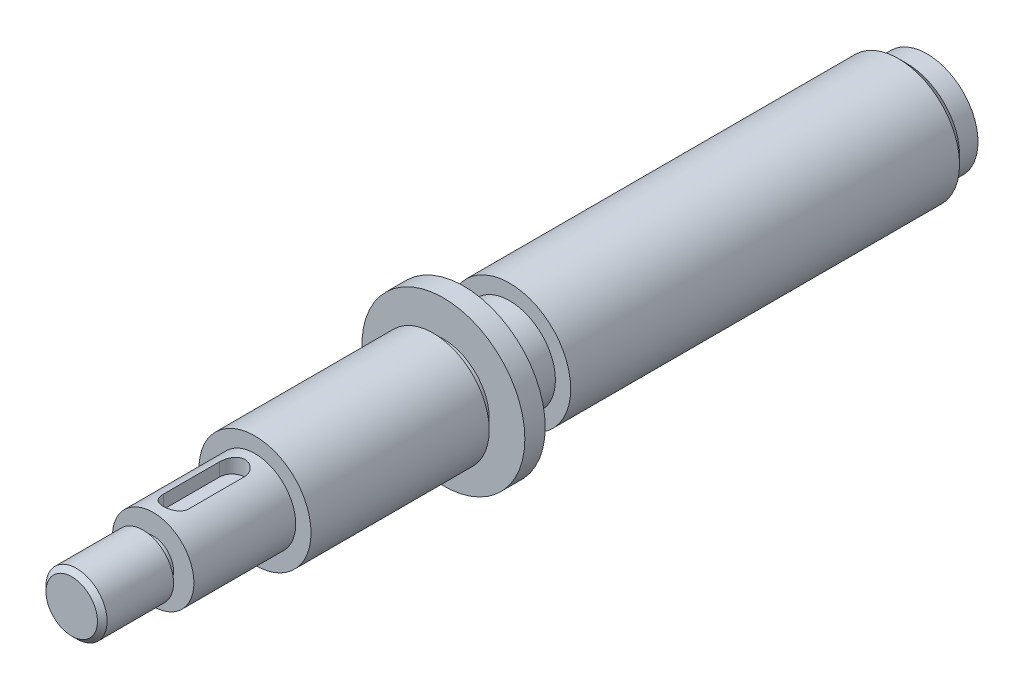
ISO-10303-21;
HEADER;
FILE_DESCRIPTION(('STEP AP214'),'2;1');
FILE_NAME('part.step','',(''),(''),'','','');
FILE_SCHEMA(('AUTOMOTIVE_DESIGN { 1 0 10303 214 1 1 1 1 }'));
ENDSEC;
DATA;
#1=APPLICATION_CONTEXT('core data for automotive mechanical design processes');
#2=APPLICATION_PROTOCOL_DEFINITION('international standard','automotive_design',2000,#1);
#3=PRODUCT_CONTEXT('',#1,'mechanical');
#4=PRODUCT('Part','Part','',(#3));
#5=PRODUCT_RELATED_PRODUCT_CATEGORY('part','',(#4));
#6=PRODUCT_DEFINITION_FORMATION('','',#4);
#7=PRODUCT_DEFINITION_CONTEXT('part definition',#1,'design');
#8=PRODUCT_DEFINITION('design','',#6,#7);
#9=PRODUCT_DEFINITION_SHAPE('','',#8);
#10=(LENGTH_UNIT() NAMED_UNIT(*) SI_UNIT(.MILLI.,.METRE.));
#11=(NAMED_UNIT(*) PLANE_ANGLE_UNIT() SI_UNIT($,.RADIAN.));
#12=(NAMED_UNIT(*) SI_UNIT($,.STERADIAN.) SOLID_ANGLE_UNIT());
#13=UNCERTAINTY_MEASURE_WITH_UNIT(LENGTH_MEASURE(1.E-05),#10,'distance_accuracy_value','');
#14=(GEOMETRIC_REPRESENTATION_CONTEXT(3) GLOBAL_UNCERTAINTY_ASSIGNED_CONTEXT((#13)) GLOBAL_UNIT_ASSIGNED_CONTEXT((#10,
#11,#12)) REPRESENTATION_CONTEXT('',''));
#15=CARTESIAN_POINT('',(0.,0.,0.));
#16=DIRECTION('',(0.,0.,1.));
#17=DIRECTION('',(1.,0.,0.));
#18=AXIS2_PLACEMENT_3D('',#15,#16,#17);
#19=CARTESIAN_POINT('',(0.,0.,97.));
#20=DIRECTION('',(0.,0.,-1.));
#21=DIRECTION('',(-1.,0.,0.));
#22=AXIS2_PLACEMENT_3D('',#19,#20,#21);
#23=CYLINDRICAL_SURFACE('',#22,9.);
#24=CARTESIAN_POINT('',(0.,0.,82.));
#25=DIRECTION('',(0.,0.,1.));
#26=DIRECTION('',(1.,0.,0.));
#27=AXIS2_PLACEMENT_3D('',#24,#25,#26);
#28=CIRCLE('',#27,9.);
#29=CARTESIAN_POINT('',(9.,0.,82.));
#30=VERTEX_POINT('',#29);
#31=EDGE_CURVE('E177',#30,#30,#28,.T.);
#32=ORIENTED_EDGE('',*,*,#31,.T.);
#33=EDGE_LOOP('',(#32));
#34=FACE_BOUND('',#33,.T.);
#35=CARTESIAN_POINT('',(0.,0.,91.));
#36=DIRECTION('',(0.,0.,1.));
#37=DIRECTION('',(1.,0.,0.));
#38=AXIS2_PLACEMENT_3D('',#35,#36,#37);
#39=CIRCLE('',#38,9.);
#40=CARTESIAN_POINT('',(9.,0.,91.));
#41=VERTEX_POINT('',#40);
#42=EDGE_CURVE('E155',#41,#41,#39,.T.);
#43=ORIENTED_EDGE('',*,*,#42,.F.);
#44=EDGE_LOOP('',(#43));
#45=FACE_BOUND('',#44,.T.);
#46=ADVANCED_FACE('F47',(#34,#45),#23,.T.);
#47=CARTESIAN_POINT('',(0.,0.,4.));
#48=DIRECTION('',(0.,0.,1.));
#49=DIRECTION('',(1.,0.,0.));
#50=AXIS2_PLACEMENT_3D('',#47,#48,#49);
#51=PLANE('',#50);
#52=CARTESIAN_POINT('',(0.,0.,4.));
#53=DIRECTION('',(0.,0.,1.));
#54=DIRECTION('',(1.,0.,0.));
#55=AXIS2_PLACEMENT_3D('',#52,#53,#54);
#56=CIRCLE('',#55,10.);
#57=CARTESIAN_POINT('',(10.,0.,4.));
#58=VERTEX_POINT('',#57);
#59=EDGE_CURVE('E181',#58,#58,#56,.T.);
#60=ORIENTED_EDGE('',*,*,#59,.T.);
#61=EDGE_LOOP('',(#60));
#62=FACE_BOUND('',#61,.T.);
#63=CARTESIAN_POINT('',(0.,0.,4.));
#64=DIRECTION('',(0.,0.,1.));
#65=DIRECTION('',(1.,0.,0.));
#66=AXIS2_PLACEMENT_3D('',#63,#64,#65);
#67=CIRCLE('',#66,10.376);
#68=CARTESIAN_POINT('',(10.376,0.,4.));
#69=VERTEX_POINT('',#68);
#70=EDGE_CURVE('E176',#69,#69,#67,.T.);
#71=ORIENTED_EDGE('',*,*,#70,.F.);
#72=EDGE_LOOP('',(#71));
#73=FACE_BOUND('',#72,.T.);
#74=ADVANCED_FACE('F266',(#62,#73),#51,.F.);
#75=CARTESIAN_POINT('',(0.,0.,4.));
#76=DIRECTION('',(0.,0.,-1.));
#77=DIRECTION('',(-1.,0.,0.));
#78=AXIS2_PLACEMENT_3D('',#75,#76,#77);
#79=CYLINDRICAL_SURFACE('',#78,10.);
#80=ORIENTED_EDGE('',*,*,#59,.F.);
#81=EDGE_LOOP('',(#80));
#82=FACE_BOUND('',#81,.T.);
#83=CARTESIAN_POINT('',(0.,0.,0.));
#84=DIRECTION('',(0.,0.,1.));
#85=DIRECTION('',(1.,0.,0.));
#86=AXIS2_PLACEMENT_3D('',#83,#84,#85);
#87=CIRCLE('',#86,10.);
#88=CARTESIAN_POINT('',(10.,0.,0.));
#89=VERTEX_POINT('',#88);
#90=EDGE_CURVE('E193',#89,#89,#87,.T.);
#91=ORIENTED_EDGE('',*,*,#90,.T.);
#92=EDGE_LOOP('',(#91));
#93=FACE_BOUND('',#92,.T.);
#94=ADVANCED_FACE('F49',(#82,#93),#79,.T.);
#95=CARTESIAN_POINT('',(0.,0.,0.));
#96=DIRECTION('',(0.,0.,1.));
#97=DIRECTION('',(1.,0.,0.));
#98=AXIS2_PLACEMENT_3D('',#95,#96,#97);
#99=PLANE('',#98);
#100=ORIENTED_EDGE('',*,*,#90,.F.);
#101=EDGE_LOOP('',(#100));
#102=FACE_BOUND('',#101,.T.);
#103=ADVANCED_FACE('F329',(#102),#99,.F.);
#104=CARTESIAN_POINT('',(0.,0.,4.));
#105=DIRECTION('',(0.,0.,1.));
#106=DIRECTION('',(1.,0.,0.));
#107=AXIS2_PLACEMENT_3D('',#104,#105,#106);
#108=CONICAL_SURFACE('',#107,10.376,0.785398163397447);
#109=CARTESIAN_POINT('',(0.,0.,5.624));
#110=DIRECTION('',(0.,0.,1.));
#111=DIRECTION('',(1.,0.,0.));
#112=AXIS2_PLACEMENT_3D('',#109,#110,#111);
#113=CIRCLE('',#112,12.);
#114=CARTESIAN_POINT('',(12.,0.,5.624));
#115=VERTEX_POINT('',#114);
#116=EDGE_CURVE('E185',#115,#115,#113,.T.);
#117=ORIENTED_EDGE('',*,*,#116,.F.);
#118=EDGE_LOOP('',(#117));
#119=FACE_BOUND('',#118,.T.);
#120=ORIENTED_EDGE('',*,*,#70,.T.);
#121=EDGE_LOOP('',(#120));
#122=FACE_BOUND('',#121,.T.);
#123=ADVANCED_FACE('F325',(#119,#122),#108,.T.);
#124=CARTESIAN_POINT('',(0.,0.,82.));
#125=DIRECTION('',(0.,0.,1.));
#126=DIRECTION('',(1.,0.,0.));
#127=AXIS2_PLACEMENT_3D('',#124,#125,#126);
#128=PLANE('',#127);
#129=ORIENTED_EDGE('',*,*,#31,.F.);
#130=EDGE_LOOP('',(#129));
#131=FACE_BOUND('',#130,.T.);
#132=CARTESIAN_POINT('',(0.,0.,82.));
#133=DIRECTION('',(0.,0.,1.));
#134=DIRECTION('',(1.,0.,0.));
#135=AXIS2_PLACEMENT_3D('',#132,#133,#134);
#136=CIRCLE('',#135,12.);
#137=CARTESIAN_POINT('',(12.,0.,82.));
#138=VERTEX_POINT('',#137);
#139=EDGE_CURVE('E189',#138,#138,#136,.T.);
#140=ORIENTED_EDGE('',*,*,#139,.T.);
#141=EDGE_LOOP('',(#140));
#142=FACE_BOUND('',#141,.T.);
#143=ADVANCED_FACE('F315',(#131,#142),#128,.T.);
#144=CARTESIAN_POINT('',(0.,0.,82.));
#145=DIRECTION('',(0.,0.,-1.));
#146=DIRECTION('',(-1.,0.,0.));
#147=AXIS2_PLACEMENT_3D('',#144,#145,#146);
#148=CYLINDRICAL_SURFACE('',#147,12.);
#149=ORIENTED_EDGE('',*,*,#116,.T.);
#150=EDGE_LOOP('',(#149));
#151=FACE_BOUND('',#150,.T.);
#152=ORIENTED_EDGE('',*,*,#139,.F.);
#153=EDGE_LOOP('',(#152));
#154=FACE_BOUND('',#153,.T.);
#155=ADVANCED_FACE('F310',(#151,#154),#148,.T.);
#156=CARTESIAN_POINT('',(0.,0.,91.));
#157=DIRECTION('',(0.,0.,1.));
#158=DIRECTION('',(1.,0.,0.));
#159=AXIS2_PLACEMENT_3D('',#156,#157,#158);
#160=CYLINDRICAL_SURFACE('',#159,16.);
#161=CARTESIAN_POINT('',(0.,0.,91.));
#162=DIRECTION('',(0.,0.,1.));
#163=DIRECTION('',(1.,0.,0.));
#164=AXIS2_PLACEMENT_3D('',#161,#162,#163);
#165=CIRCLE('',#164,16.);
#166=CARTESIAN_POINT('',(16.,0.,91.));
#167=VERTEX_POINT('',#166);
#168=EDGE_CURVE('E164',#167,#167,#165,.T.);
#169=ORIENTED_EDGE('',*,*,#168,.T.);
#170=EDGE_LOOP('',(#169));
#171=FACE_BOUND('',#170,.T.);
#172=CARTESIAN_POINT('',(0.,0.,95.));
#173=DIRECTION('',(0.,0.,1.));
#174=DIRECTION('',(1.,0.,0.));
#175=AXIS2_PLACEMENT_3D('',#172,#173,#174);
#176=CIRCLE('',#175,16.);
#177=CARTESIAN_POINT('',(16.,0.,95.));
#178=VERTEX_POINT('',#177);
#179=EDGE_CURVE('E160',#178,#178,#176,.T.);
#180=ORIENTED_EDGE('',*,*,#179,.F.);
#181=EDGE_LOOP('',(#180));
#182=FACE_BOUND('',#181,.T.);
#183=ADVANCED_FACE('F308',(#171,#182),#160,.T.);
#184=CARTESIAN_POINT('',(0.,0.,91.));
#185=DIRECTION('',(0.,0.,1.));
#186=DIRECTION('',(1.,0.,0.));
#187=AXIS2_PLACEMENT_3D('',#184,#185,#186);
#188=PLANE('',#187);
#189=ORIENTED_EDGE('',*,*,#42,.T.);
#190=EDGE_LOOP('',(#189));
#191=FACE_BOUND('',#190,.T.);
#192=ORIENTED_EDGE('',*,*,#168,.F.);
#193=EDGE_LOOP('',(#192));
#194=FACE_BOUND('',#193,.T.);
#195=ADVANCED_FACE('F291',(#191,#194),#188,.F.);
#196=CARTESIAN_POINT('',(0.,0.,95.));
#197=DIRECTION('',(0.,0.,1.));
#198=DIRECTION('',(1.,0.,0.));
#199=AXIS2_PLACEMENT_3D('',#196,#197,#198);
#200=PLANE('',#199);
#201=CARTESIAN_POINT('',(0.,0.,95.));
#202=DIRECTION('',(0.,0.,1.));
#203=DIRECTION('',(1.,0.,0.));
#204=AXIS2_PLACEMENT_3D('',#201,#202,#203);
#205=CIRCLE('',#204,9.);
#206=CARTESIAN_POINT('',(9.,0.,95.));
#207=VERTEX_POINT('',#206);
#208=EDGE_CURVE('E168',#207,#207,#205,.T.);
#209=ORIENTED_EDGE('',*,*,#208,.F.);
#210=EDGE_LOOP('',(#209));
#211=FACE_BOUND('',#210,.T.);
#212=ORIENTED_EDGE('',*,*,#179,.T.);
#213=EDGE_LOOP('',(#212));
#214=FACE_BOUND('',#213,.T.);
#215=ADVANCED_FACE('F282',(#211,#214),#200,.T.);
#216=ORIENTED_EDGE('',*,*,#208,.T.);
#217=EDGE_LOOP('',(#216));
#218=FACE_BOUND('',#217,.T.);
#219=CARTESIAN_POINT('',(0.,0.,97.));
#220=DIRECTION('',(0.,0.,1.));
#221=DIRECTION('',(1.,0.,0.));
#222=AXIS2_PLACEMENT_3D('',#219,#220,#221);
#223=CIRCLE('',#222,9.);
#224=CARTESIAN_POINT('',(9.,0.,97.));
#225=VERTEX_POINT('',#224);
#226=EDGE_CURVE('E172',#225,#225,#223,.T.);
#227=ORIENTED_EDGE('',*,*,#226,.F.);
#228=EDGE_LOOP('',(#227));
#229=FACE_BOUND('',#228,.T.);
#230=ADVANCED_FACE('F269',(#218,#229),#23,.T.);
#231=CARTESIAN_POINT('',(0.,0.,132.));
#232=DIRECTION('',(0.,0.,-1.));
#233=DIRECTION('',(-1.,0.,0.));
#234=AXIS2_PLACEMENT_3D('',#231,#232,#233);
#235=CYLINDRICAL_SURFACE('',#234,11.);
#236=CARTESIAN_POINT('',(0.,0.,132.));
#237=DIRECTION('',(0.,0.,1.));
#238=DIRECTION('',(1.,0.,0.));
#239=AXIS2_PLACEMENT_3D('',#236,#237,#238);
#240=CIRCLE('',#239,11.);
#241=CARTESIAN_POINT('',(11.,0.,132.));
#242=VERTEX_POINT('',#241);
#243=EDGE_CURVE('E156',#242,#242,#240,.T.);
#244=ORIENTED_EDGE('',*,*,#243,.F.);
#245=EDGE_LOOP('',(#244));
#246=FACE_BOUND('',#245,.T.);
#247=CARTESIAN_POINT('',(0.,0.,97.));
#248=DIRECTION('',(0.,0.,1.));
#249=DIRECTION('',(1.,0.,0.));
#250=AXIS2_PLACEMENT_3D('',#247,#248,#249);
#251=CIRCLE('',#250,11.);
#252=CARTESIAN_POINT('',(11.,0.,97.));
#253=VERTEX_POINT('',#252);
#254=EDGE_CURVE('E149',#253,#253,#251,.T.);
#255=ORIENTED_EDGE('',*,*,#254,.T.);
#256=EDGE_LOOP('',(#255));
#257=FACE_BOUND('',#256,.T.);
#258=ADVANCED_FACE('F281',(#246,#257),#235,.T.);
#259=CARTESIAN_POINT('',(0.,0.,132.));
#260=DIRECTION('',(0.,0.,1.));
#261=DIRECTION('',(1.,0.,0.));
#262=AXIS2_PLACEMENT_3D('',#259,#260,#261);
#263=PLANE('',#262);
#264=CARTESIAN_POINT('',(0.,0.,132.));
#265=DIRECTION('',(0.,0.,1.));
#266=DIRECTION('',(1.,0.,0.));
#267=AXIS2_PLACEMENT_3D('',#264,#265,#266);
#268=CIRCLE('',#267,8.);
#269=CARTESIAN_POINT('',(8.,0.,132.));
#270=VERTEX_POINT('',#269);
#271=EDGE_CURVE('E150',#270,#270,#268,.T.);
#272=ORIENTED_EDGE('',*,*,#271,.F.);
#273=EDGE_LOOP('',(#272));
#274=FACE_BOUND('',#273,.T.);
#275=ORIENTED_EDGE('',*,*,#243,.T.);
#276=EDGE_LOOP('',(#275));
#277=FACE_BOUND('',#276,.T.);
#278=ADVANCED_FACE('F288',(#274,#277),#263,.T.);
#279=CARTESIAN_POINT('',(0.,0.,97.));
#280=DIRECTION('',(0.,0.,1.));
#281=DIRECTION('',(1.,0.,0.));
#282=AXIS2_PLACEMENT_3D('',#279,#280,#281);
#283=PLANE('',#282);
#284=ORIENTED_EDGE('',*,*,#226,.T.);
#285=EDGE_LOOP('',(#284));
#286=FACE_BOUND('',#285,.T.);
#287=ORIENTED_EDGE('',*,*,#254,.F.);
#288=EDGE_LOOP('',(#287));
#289=FACE_BOUND('',#288,.T.);
#290=ADVANCED_FACE('F262',(#286,#289),#283,.F.);
#291=CARTESIAN_POINT('',(0.,0.,152.));
#292=DIRECTION('',(0.,0.,-1.));
#293=DIRECTION('',(-1.,0.,0.));
#294=AXIS2_PLACEMENT_3D('',#291,#292,#293);
#295=CYLINDRICAL_SURFACE('',#294,8.);
#296=DIRECTION('',(0.,0.,-1.));
#297=VECTOR('',#296,1.);
#298=CARTESIAN_POINT('',(-2.5,7.59934207678533,152.));
#299=LINE('',#298,#297);
#300=CARTESIAN_POINT('',(-2.5,7.59934207678533,147.5));
#301=VERTEX_POINT('',#300);
#302=CARTESIAN_POINT('',(-2.5,7.59934207678533,136.5));
#303=VERTEX_POINT('',#302);
#304=EDGE_CURVE('E11',#301,#303,#299,.T.);
#305=ORIENTED_EDGE('',*,*,#304,.T.);
#306=CARTESIAN_POINT('',(-2.5,7.59934207678533,136.5));
#307=CARTESIAN_POINT('',(-2.5000087198661,7.59933203220923,136.431533959542));
#308=CARTESIAN_POINT('',(-2.4971876157067,7.60026710840753,136.363073619971));
#309=CARTESIAN_POINT('',(-2.48595363160137,7.60395280971297,136.22667850974));
#310=CARTESIAN_POINT('',(-2.47754209932592,7.60670299725468,136.158743616404));
#311=CARTESIAN_POINT('',(-2.45522504986811,7.61393458112745,136.024061009484));
#312=CARTESIAN_POINT('',(-2.44133433374917,7.61841131278037,135.957310599703));
#313=CARTESIAN_POINT('',(-2.40819742021322,7.6289504842887,135.825298022107));
#314=CARTESIAN_POINT('',(-2.38895106360388,7.63501297127917,135.760035898591));
#315=CARTESIAN_POINT('',(-2.32342181812057,7.65531370854753,135.567212223593));
#316=CARTESIAN_POINT('',(-2.26931834783614,7.67167572075674,135.442431941926));
#317=CARTESIAN_POINT('',(-2.14195853375279,7.70820192005305,135.203712430218));
#318=CARTESIAN_POINT('',(-2.06869223942944,7.72836808096863,135.089778874515));
#319=CARTESIAN_POINT('',(-1.90239488450142,7.77100200100207,134.872050023827));
#320=CARTESIAN_POINT('',(-1.80882220629731,7.79352168290434,134.768677735611));
#321=CARTESIAN_POINT('',(-1.60572727956462,7.83788426191899,134.578809182704));
#322=CARTESIAN_POINT('',(-1.49620229248911,7.85972704204464,134.492315821611));
#323=CARTESIAN_POINT('',(-1.26124953771773,7.90087147079049,134.336776735916));
#324=CARTESIAN_POINT('',(-1.13551807880448,7.92010445950432,134.268169952633));
#325=CARTESIAN_POINT('',(-0.873602960335171,7.95325160259884,134.153245915022));
#326=CARTESIAN_POINT('',(-0.737422187737952,7.96716721976608,134.106922529715));
#327=CARTESIAN_POINT('',(-0.462930099012004,7.98774341182992,134.039298114011));
#328=CARTESIAN_POINT('',(-0.324814247508672,7.99461464054537,134.017268955253));
#329=CARTESIAN_POINT('',(-0.0466844774607949,8.00107192504111,133.996551274495));
#330=CARTESIAN_POINT('',(0.093329042112164,8.00065948912979,133.997857920095));
#331=CARTESIAN_POINT('',(0.366149731450019,7.99274230032515,134.023296654597));
#332=CARTESIAN_POINT('',(0.499038795981163,7.98548293529422,134.046639028148));
#333=CARTESIAN_POINT('',(0.758907586787322,7.96498949974384,134.114190495561));
#334=CARTESIAN_POINT('',(0.885886994958719,7.95175510801139,134.158400711269));
#335=CARTESIAN_POINT('',(1.13215685546553,7.92046911120711,134.26694063306));
#336=CARTESIAN_POINT('',(1.25133405945161,7.90236047967987,134.33151017529));
#337=CARTESIAN_POINT('',(1.47740616192355,7.86323423851861,134.478743196476));
#338=CARTESIAN_POINT('',(1.58429807402893,7.84221592430771,134.561411060751));
#339=CARTESIAN_POINT('',(1.78746586607462,7.79847545376802,134.746538136396));
#340=CARTESIAN_POINT('',(1.88311543585898,7.77571879037653,134.849677407732));
#341=CARTESIAN_POINT('',(2.05596538849195,7.73181622612155,135.070770310105));
#342=CARTESIAN_POINT('',(2.13316021206709,7.71067081193134,135.18872838885));
#343=CARTESIAN_POINT('',(2.26764925997605,7.67220528704821,135.437902943186));
#344=CARTESIAN_POINT('',(2.32470027293309,7.65493278862476,135.569258301466));
#345=CARTESIAN_POINT('',(2.41560912229749,7.62673815128782,135.840311873047));
#346=CARTESIAN_POINT('',(2.4495027938281,7.61580620458632,135.979996830688));
#347=CARTESIAN_POINT('',(2.48078343133094,7.60564225124819,136.184175101008));
#348=CARTESIAN_POINT('',(2.48798807259048,7.60328541577438,136.247144936942));
#349=CARTESIAN_POINT('',(2.49759244704775,7.60013482131107,136.373398993346));
#350=CARTESIAN_POINT('',(2.4999989655896,7.59933885501905,136.436682642797));
#351=CARTESIAN_POINT('',(2.5,7.59934207678533,136.5));
#352=B_SPLINE_CURVE_WITH_KNOTS('',3,(#306,#307,#308,#309,#310,#311,#312,#313,#314,#315,#316,
#317,#318,#319,#320,#321,#322,#323,#324,#325,#326,#327,#328,#329,#330,#331,#332,#333,#334,#335,
#336,#337,#338,#339,#340,#341,#342,#343,#344,#345,#346,#347,#348,#349,#350,#351),.UNSPECIFIED.,
.F.,.F.,(4,2,2,2,2,2,2,2,2,2,2,2,2,2,2,2,2,2,2,2,2,2,4),(0.,0.20532395987906,0.410598440771373,
0.615322164613742,0.820051974362703,1.22896577749257,1.63809233699274,2.05988351400981,
2.48174718582288,2.91315381297357,3.34444167638913,3.76241894392419,4.18030965733328,
4.58377069824372,4.98725343150324,5.39567896994656,5.8042035818021,6.22971654236832,
6.65535752260761,7.08597472101489,7.51592403685474,7.70602799872314,7.89586293072483),.UNSPECIFIED.);
#353=CARTESIAN_POINT('',(2.5,7.59934207678533,136.5));
#354=VERTEX_POINT('',#353);
#355=EDGE_CURVE('E154',#303,#354,#352,.T.);
#356=ORIENTED_EDGE('',*,*,#355,.T.);
#357=DIRECTION('',(0.,0.,-1.));
#358=VECTOR('',#357,1.);
#359=CARTESIAN_POINT('',(2.5,7.59934207678533,152.));
#360=LINE('',#359,#358);
#361=CARTESIAN_POINT('',(2.5,7.59934207678533,147.5));
#362=VERTEX_POINT('',#361);
#363=EDGE_CURVE('E56',#354,#362,#360,.F.);
#364=ORIENTED_EDGE('',*,*,#363,.T.);
#365=CARTESIAN_POINT('',(2.5,7.59934207678533,147.5));
#366=CARTESIAN_POINT('',(2.5000087198661,7.59933203220922,147.568466040458));
#367=CARTESIAN_POINT('',(2.4971876157067,7.60026710840752,147.636926380029));
#368=CARTESIAN_POINT('',(2.48595363160137,7.60395280971297,147.77332149026));
#369=CARTESIAN_POINT('',(2.47754209932592,7.60670299725468,147.841256383596));
#370=CARTESIAN_POINT('',(2.45522504986811,7.61393458112745,147.975938990516));
#371=CARTESIAN_POINT('',(2.44133433374917,7.61841131278037,148.042689400297));
#372=CARTESIAN_POINT('',(2.40819742021322,7.6289504842887,148.174701977894));
#373=CARTESIAN_POINT('',(2.38895106360388,7.63501297127917,148.239964101409));
#374=CARTESIAN_POINT('',(2.32342181812057,7.65531370854753,148.432787776407));
#375=CARTESIAN_POINT('',(2.26931834783614,7.67167572075675,148.557568058074));
#376=CARTESIAN_POINT('',(2.14195853375279,7.70820192005305,148.796287569782));
#377=CARTESIAN_POINT('',(2.06869223942944,7.72836808096863,148.910221125485));
#378=CARTESIAN_POINT('',(1.90239488450142,7.77100200100207,149.127949976173));
#379=CARTESIAN_POINT('',(1.8088222062973,7.79352168290434,149.231322264389));
#380=CARTESIAN_POINT('',(1.60572727956462,7.83788426191899,149.421190817296));
#381=CARTESIAN_POINT('',(1.49620229248911,7.85972704204464,149.507684178389));
#382=CARTESIAN_POINT('',(1.26124953771772,7.90087147079049,149.663223264084));
#383=CARTESIAN_POINT('',(1.13551807880448,7.92010445950432,149.731830047367));
#384=CARTESIAN_POINT('',(0.87360296033517,7.95325160259884,149.846754084978));
#385=CARTESIAN_POINT('',(0.737422187737951,7.96716721976608,149.893077470285));
#386=CARTESIAN_POINT('',(0.462930099012005,7.98774341182992,149.960701885989));
#387=CARTESIAN_POINT('',(0.324814247508675,7.99461464054537,149.982731044747));
#388=CARTESIAN_POINT('',(0.046684477460798,8.00107192504111,150.003448725505));
#389=CARTESIAN_POINT('',(-0.0933290421121623,8.00065948912979,150.002142079905));
#390=CARTESIAN_POINT('',(-0.366149731450019,7.99274230032515,149.976703345403));
#391=CARTESIAN_POINT('',(-0.499038795981162,7.98548293529422,149.953360971852));
#392=CARTESIAN_POINT('',(-0.758907586787322,7.96498949974384,149.885809504439));
#393=CARTESIAN_POINT('',(-0.885886994958719,7.95175510801139,149.841599288731));
#394=CARTESIAN_POINT('',(-1.13215685546553,7.92046911120711,149.73305936694));
#395=CARTESIAN_POINT('',(-1.2513340594516,7.90236047967987,149.66848982471));
#396=CARTESIAN_POINT('',(-1.47740616192355,7.86323423851861,149.521256803524));
#397=CARTESIAN_POINT('',(-1.58429807402893,7.84221592430771,149.438588939249));
#398=CARTESIAN_POINT('',(-1.78746586607462,7.79847545376802,149.253461863604));
#399=CARTESIAN_POINT('',(-1.88311543585898,7.77571879037653,149.150322592268));
#400=CARTESIAN_POINT('',(-2.05596538849195,7.73181622612155,148.929229689895));
#401=CARTESIAN_POINT('',(-2.13316021206709,7.71067081193134,148.81127161115));
#402=CARTESIAN_POINT('',(-2.26764925997605,7.67220528704821,148.562097056814));
#403=CARTESIAN_POINT('',(-2.32470027293309,7.65493278862476,148.430741698534));
#404=CARTESIAN_POINT('',(-2.41560912229749,7.62673815128782,148.159688126953));
#405=CARTESIAN_POINT('',(-2.4495027938281,7.61580620458632,148.020003169312));
#406=CARTESIAN_POINT('',(-2.48078343133094,7.60564225124819,147.815824898992));
#407=CARTESIAN_POINT('',(-2.48798807259048,7.60328541577438,147.752855063058));
#408=CARTESIAN_POINT('',(-2.49759244704775,7.60013482131107,147.626601006654));
#409=CARTESIAN_POINT('',(-2.4999989655896,7.59933885501905,147.563317357203));
#410=CARTESIAN_POINT('',(-2.5,7.59934207678533,147.5));
#411=B_SPLINE_CURVE_WITH_KNOTS('',3,(#365,#366,#367,#368,#369,#370,#371,#372,#373,#374,#375,
#376,#377,#378,#379,#380,#381,#382,#383,#384,#385,#386,#387,#388,#389,#390,#391,#392,#393,#394,
#395,#396,#397,#398,#399,#400,#401,#402,#403,#404,#405,#406,#407,#408,#409,#410),.UNSPECIFIED.,
.F.,.F.,(4,2,2,2,2,2,2,2,2,2,2,2,2,2,2,2,2,2,2,2,2,2,4),(0.,0.20532395987906,0.410598440771373,
0.615322164613742,0.820051974362703,1.22896577749257,1.63809233699274,2.05988351400981,
2.48174718582288,2.91315381297357,3.34444167638913,3.76241894392419,4.18030965733328,
4.58377069824372,4.98725343150324,5.39567896994656,5.8042035818021,6.22971654236831,
6.65535752260761,7.08597472101489,7.51592403685474,7.70602799872311,7.89586293072483),.UNSPECIFIED.);
#412=EDGE_CURVE('E63',#362,#301,#411,.T.);
#413=ORIENTED_EDGE('',*,*,#412,.T.);
#414=EDGE_LOOP('',(#305,#356,#364,#413));
#415=FACE_BOUND('',#414,.T.);
#416=CARTESIAN_POINT('',(0.,0.,152.));
#417=DIRECTION('',(0.,0.,1.));
#418=DIRECTION('',(1.,0.,0.));
#419=AXIS2_PLACEMENT_3D('',#416,#417,#418);
#420=CIRCLE('',#419,8.);
#421=CARTESIAN_POINT('',(8.,0.,152.));
#422=VERTEX_POINT('',#421);
#423=EDGE_CURVE('E145',#422,#422,#420,.T.);
#424=ORIENTED_EDGE('',*,*,#423,.F.);
#425=EDGE_LOOP('',(#424));
#426=FACE_BOUND('',#425,.T.);
#427=ORIENTED_EDGE('',*,*,#271,.T.);
#428=EDGE_LOOP('',(#427));
#429=FACE_BOUND('',#428,.T.);
#430=ADVANCED_FACE('F220',(#415,#426,#429),#295,.T.);
#431=CARTESIAN_POINT('',(0.,0.,152.));
#432=DIRECTION('',(0.,0.,1.));
#433=DIRECTION('',(1.,0.,0.));
#434=AXIS2_PLACEMENT_3D('',#431,#432,#433);
#435=PLANE('',#434);
#436=ORIENTED_EDGE('',*,*,#423,.T.);
#437=EDGE_LOOP('',(#436));
#438=FACE_BOUND('',#437,.T.);
#439=CARTESIAN_POINT('',(0.,0.,152.));
#440=DIRECTION('',(0.,0.,1.));
#441=DIRECTION('',(1.,0.,0.));
#442=AXIS2_PLACEMENT_3D('',#439,#440,#441);
#443=CIRCLE('',#442,4.);
#444=CARTESIAN_POINT('',(4.,0.,152.));
#445=VERTEX_POINT('',#444);
#446=EDGE_CURVE('E133',#445,#445,#443,.T.);
#447=ORIENTED_EDGE('',*,*,#446,.F.);
#448=EDGE_LOOP('',(#447));
#449=FACE_BOUND('',#448,.T.);
#450=ADVANCED_FACE('F249',(#438,#449),#435,.T.);
#451=CARTESIAN_POINT('',(0.,0.,154.));
#452=DIRECTION('',(0.,0.,1.));
#453=DIRECTION('',(1.,0.,0.));
#454=AXIS2_PLACEMENT_3D('',#451,#452,#453);
#455=PLANE('',#454);
#456=CARTESIAN_POINT('',(0.,0.,154.));
#457=DIRECTION('',(0.,0.,1.));
#458=DIRECTION('',(1.,0.,0.));
#459=AXIS2_PLACEMENT_3D('',#456,#457,#458);
#460=CIRCLE('',#459,6.);
#461=CARTESIAN_POINT('',(6.,0.,154.));
#462=VERTEX_POINT('',#461);
#463=EDGE_CURVE('E138',#462,#462,#460,.T.);
#464=ORIENTED_EDGE('',*,*,#463,.F.);
#465=EDGE_LOOP('',(#464));
#466=FACE_BOUND('',#465,.T.);
#467=CARTESIAN_POINT('',(0.,0.,154.));
#468=DIRECTION('',(0.,0.,1.));
#469=DIRECTION('',(1.,0.,0.));
#470=AXIS2_PLACEMENT_3D('',#467,#468,#469);
#471=CIRCLE('',#470,4.);
#472=CARTESIAN_POINT('',(4.,0.,154.));
#473=VERTEX_POINT('',#472);
#474=EDGE_CURVE('E134',#473,#473,#471,.T.);
#475=ORIENTED_EDGE('',*,*,#474,.T.);
#476=EDGE_LOOP('',(#475));
#477=FACE_BOUND('',#476,.T.);
#478=ADVANCED_FACE('F245',(#466,#477),#455,.F.);
#479=CARTESIAN_POINT('',(0.,0.,154.));
#480=DIRECTION('',(0.,0.,-1.));
#481=DIRECTION('',(-1.,0.,0.));
#482=AXIS2_PLACEMENT_3D('',#479,#480,#481);
#483=CYLINDRICAL_SURFACE('',#482,4.);
#484=ORIENTED_EDGE('',*,*,#474,.F.);
#485=EDGE_LOOP('',(#484));
#486=FACE_BOUND('',#485,.T.);
#487=ORIENTED_EDGE('',*,*,#446,.T.);
#488=EDGE_LOOP('',(#487));
#489=FACE_BOUND('',#488,.T.);
#490=ADVANCED_FACE('F242',(#486,#489),#483,.T.);
#491=CARTESIAN_POINT('',(0.,0.,168.));
#492=DIRECTION('',(0.,0.,-1.));
#493=DIRECTION('',(-1.,0.,0.));
#494=AXIS2_PLACEMENT_3D('',#491,#492,#493);
#495=CYLINDRICAL_SURFACE('',#494,6.);
#496=CARTESIAN_POINT('',(0.,0.,167.053));
#497=DIRECTION('',(0.,0.,-1.));
#498=DIRECTION('',(-1.,0.,0.));
#499=AXIS2_PLACEMENT_3D('',#496,#497,#498);
#500=CIRCLE('',#499,6.);
#501=CARTESIAN_POINT('',(-6.,0.,167.053));
#502=VERTEX_POINT('',#501);
#503=EDGE_CURVE('E129',#502,#502,#500,.T.);
#504=ORIENTED_EDGE('',*,*,#503,.T.);
#505=EDGE_LOOP('',(#504));
#506=FACE_BOUND('',#505,.T.);
#507=ORIENTED_EDGE('',*,*,#463,.T.);
#508=EDGE_LOOP('',(#507));
#509=FACE_BOUND('',#508,.T.);
#510=ADVANCED_FACE('F240',(#506,#509),#495,.T.);
#511=CARTESIAN_POINT('',(0.,0.,168.));
#512=DIRECTION('',(0.,0.,-1.));
#513=DIRECTION('',(-1.,0.,0.));
#514=AXIS2_PLACEMENT_3D('',#511,#512,#513);
#515=CONICAL_SURFACE('',#514,5.053,0.78539816339746);
#516=ORIENTED_EDGE('',*,*,#503,.F.);
#517=EDGE_LOOP('',(#516));
#518=FACE_BOUND('',#517,.T.);
#519=CARTESIAN_POINT('',(0.,0.,168.));
#520=DIRECTION('',(0.,0.,-1.));
#521=DIRECTION('',(-1.,0.,0.));
#522=AXIS2_PLACEMENT_3D('',#519,#520,#521);
#523=CIRCLE('',#522,5.053);
#524=CARTESIAN_POINT('',(-5.053,0.,168.));
#525=VERTEX_POINT('',#524);
#526=EDGE_CURVE('E120',#525,#525,#523,.T.);
#527=ORIENTED_EDGE('',*,*,#526,.T.);
#528=EDGE_LOOP('',(#527));
#529=FACE_BOUND('',#528,.T.);
#530=ADVANCED_FACE('F237',(#518,#529),#515,.T.);
#531=CARTESIAN_POINT('',(0.,0.,168.));
#532=DIRECTION('',(0.,0.,1.));
#533=DIRECTION('',(1.,0.,0.));
#534=AXIS2_PLACEMENT_3D('',#531,#532,#533);
#535=PLANE('',#534);
#536=ORIENTED_EDGE('',*,*,#526,.F.);
#537=EDGE_LOOP('',(#536));
#538=FACE_BOUND('',#537,.T.);
#539=ADVANCED_FACE('F236',(#538),#535,.T.);
#540=CARTESIAN_POINT('',(0.,5.,147.5));
#541=DIRECTION('',(0.,1.,0.));
#542=DIRECTION('',(0.,0.,1.));
#543=AXIS2_PLACEMENT_3D('',#540,#541,#542);
#544=CYLINDRICAL_SURFACE('',#543,2.5);
#545=DIRECTION('',(0.,1.,0.));
#546=VECTOR('',#545,1.);
#547=CARTESIAN_POINT('',(2.5,5.,147.5));
#548=LINE('',#547,#546);
#549=CARTESIAN_POINT('',(2.5,5.,147.5));
#550=VERTEX_POINT('',#549);
#551=EDGE_CURVE('E86',#550,#362,#548,.T.);
#552=ORIENTED_EDGE('',*,*,#551,.F.);
#553=CARTESIAN_POINT('',(0.,5.,147.5));
#554=DIRECTION('',(0.,1.,0.));
#555=DIRECTION('',(0.,0.,1.));
#556=AXIS2_PLACEMENT_3D('',#553,#554,#555);
#557=CIRCLE('',#556,2.5);
#558=CARTESIAN_POINT('',(-2.5,5.,147.5));
#559=VERTEX_POINT('',#558);
#560=EDGE_CURVE('E90',#559,#550,#557,.T.);
#561=ORIENTED_EDGE('',*,*,#560,.F.);
#562=DIRECTION('',(0.,1.,0.));
#563=VECTOR('',#562,1.);
#564=CARTESIAN_POINT('',(-2.5,5.,147.5));
#565=LINE('',#564,#563);
#566=EDGE_CURVE('E117',#559,#301,#565,.T.);
#567=ORIENTED_EDGE('',*,*,#566,.T.);
#568=ORIENTED_EDGE('',*,*,#412,.F.);
#569=EDGE_LOOP('',(#552,#561,#567,#568));
#570=FACE_BOUND('',#569,.T.);
#571=ADVANCED_FACE('F88',(#570),#544,.F.);
#572=CARTESIAN_POINT('',(-2.5,5.,147.5));
#573=DIRECTION('',(-1.,0.,0.));
#574=DIRECTION('',(0.,0.,1.));
#575=AXIS2_PLACEMENT_3D('',#572,#573,#574);
#576=PLANE('',#575);
#577=ORIENTED_EDGE('',*,*,#566,.F.);
#578=DIRECTION('',(0.,0.,1.));
#579=VECTOR('',#578,1.);
#580=CARTESIAN_POINT('',(-2.5,5.,147.5));
#581=LINE('',#580,#579);
#582=CARTESIAN_POINT('',(-2.5,5.,136.5));
#583=VERTEX_POINT('',#582);
#584=EDGE_CURVE('E96',#583,#559,#581,.T.);
#585=ORIENTED_EDGE('',*,*,#584,.F.);
#586=DIRECTION('',(0.,1.,0.));
#587=VECTOR('',#586,1.);
#588=CARTESIAN_POINT('',(-2.5,5.,136.5));
#589=LINE('',#588,#587);
#590=EDGE_CURVE('E121',#583,#303,#589,.T.);
#591=ORIENTED_EDGE('',*,*,#590,.T.);
#592=ORIENTED_EDGE('',*,*,#304,.F.);
#593=EDGE_LOOP('',(#577,#585,#591,#592));
#594=FACE_BOUND('',#593,.T.);
#595=ADVANCED_FACE('F229',(#594),#576,.F.);
#596=CARTESIAN_POINT('',(0.,5.,136.5));
#597=DIRECTION('',(0.,1.,0.));
#598=DIRECTION('',(0.,0.,1.));
#599=AXIS2_PLACEMENT_3D('',#596,#597,#598);
#600=CYLINDRICAL_SURFACE('',#599,2.5);
#601=ORIENTED_EDGE('',*,*,#590,.F.);
#602=CARTESIAN_POINT('',(0.,5.,136.5));
#603=DIRECTION('',(0.,1.,0.));
#604=DIRECTION('',(0.,0.,1.));
#605=AXIS2_PLACEMENT_3D('',#602,#603,#604);
#606=CIRCLE('',#605,2.5);
#607=CARTESIAN_POINT('',(2.5,5.,136.5));
#608=VERTEX_POINT('',#607);
#609=EDGE_CURVE('E106',#608,#583,#606,.T.);
#610=ORIENTED_EDGE('',*,*,#609,.F.);
#611=DIRECTION('',(0.,1.,0.));
#612=VECTOR('',#611,1.);
#613=CARTESIAN_POINT('',(2.5,5.,136.5));
#614=LINE('',#613,#612);
#615=EDGE_CURVE('E95',#608,#354,#614,.T.);
#616=ORIENTED_EDGE('',*,*,#615,.T.);
#617=ORIENTED_EDGE('',*,*,#355,.F.);
#618=EDGE_LOOP('',(#601,#610,#616,#617));
#619=FACE_BOUND('',#618,.T.);
#620=ADVANCED_FACE('F224',(#619),#600,.F.);
#621=CARTESIAN_POINT('',(2.5,5.,147.5));
#622=DIRECTION('',(1.,0.,0.));
#623=DIRECTION('',(0.,0.,-1.));
#624=AXIS2_PLACEMENT_3D('',#621,#622,#623);
#625=PLANE('',#624);
#626=ORIENTED_EDGE('',*,*,#615,.F.);
#627=DIRECTION('',(0.,0.,-1.));
#628=VECTOR('',#627,1.);
#629=CARTESIAN_POINT('',(2.5,5.,147.5));
#630=LINE('',#629,#628);
#631=EDGE_CURVE('E99',#550,#608,#630,.T.);
#632=ORIENTED_EDGE('',*,*,#631,.F.);
#633=ORIENTED_EDGE('',*,*,#551,.T.);
#634=ORIENTED_EDGE('',*,*,#363,.F.);
#635=EDGE_LOOP('',(#626,#632,#633,#634));
#636=FACE_BOUND('',#635,.T.);
#637=ADVANCED_FACE('F100',(#636),#625,.F.);
#638=CARTESIAN_POINT('',(0.,5.,147.5));
#639=DIRECTION('',(0.,1.,0.));
#640=DIRECTION('',(0.,0.,1.));
#641=AXIS2_PLACEMENT_3D('',#638,#639,#640);
#642=PLANE('',#641);
#643=ORIENTED_EDGE('',*,*,#560,.T.);
#644=ORIENTED_EDGE('',*,*,#631,.T.);
#645=ORIENTED_EDGE('',*,*,#609,.T.);
#646=ORIENTED_EDGE('',*,*,#584,.T.);
#647=EDGE_LOOP('',(#643,#644,#645,#646));
#648=FACE_BOUND('',#647,.T.);
#649=ADVANCED_FACE('F108',(#648),#642,.T.);
#650=CLOSED_SHELL('',(#46,#74,#94,#103,#123,#143,#155,#183,#195,#215,#230,#258,#278,#290,#430,
#450,#478,#490,#510,#530,#539,#571,#595,#620,#637,#649));
#651=MANIFOLD_SOLID_BREP('B2',#650);
#652=ADVANCED_BREP_SHAPE_REPRESENTATION('',(#18,#651),#14);
#653=SHAPE_DEFINITION_REPRESENTATION(#9,#652);
ENDSEC;
END-ISO-10303-21;
